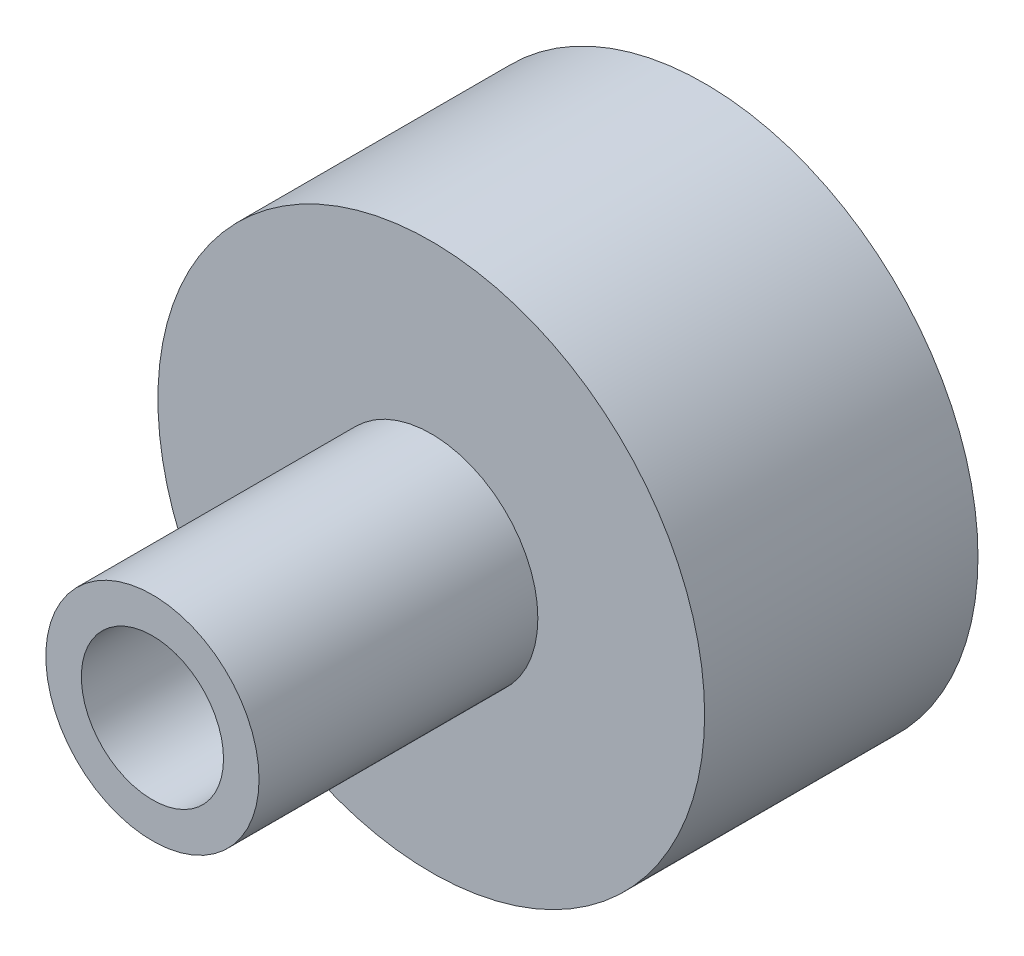
ISO-10303-21;
HEADER;
FILE_DESCRIPTION(('STEP AP214'),'2;1');
FILE_NAME('part.step','',(''),(''),'','','');
FILE_SCHEMA(('AUTOMOTIVE_DESIGN { 1 0 10303 214 1 1 1 1 }'));
ENDSEC;
DATA;
#1=APPLICATION_CONTEXT('core data for automotive mechanical design processes');
#2=APPLICATION_PROTOCOL_DEFINITION('international standard','automotive_design',2000,#1);
#3=PRODUCT_CONTEXT('',#1,'mechanical');
#4=PRODUCT('Part','Part','',(#3));
#5=PRODUCT_RELATED_PRODUCT_CATEGORY('part','',(#4));
#6=PRODUCT_DEFINITION_FORMATION('','',#4);
#7=PRODUCT_DEFINITION_CONTEXT('part definition',#1,'design');
#8=PRODUCT_DEFINITION('design','',#6,#7);
#9=PRODUCT_DEFINITION_SHAPE('','',#8);
#10=(LENGTH_UNIT() NAMED_UNIT(*) SI_UNIT(.MILLI.,.METRE.));
#11=(NAMED_UNIT(*) PLANE_ANGLE_UNIT() SI_UNIT($,.RADIAN.));
#12=(NAMED_UNIT(*) SI_UNIT($,.STERADIAN.) SOLID_ANGLE_UNIT());
#13=UNCERTAINTY_MEASURE_WITH_UNIT(LENGTH_MEASURE(1.E-05),#10,'distance_accuracy_value','');
#14=(GEOMETRIC_REPRESENTATION_CONTEXT(3) GLOBAL_UNCERTAINTY_ASSIGNED_CONTEXT((#13)) GLOBAL_UNIT_ASSIGNED_CONTEXT((#10,
#11,#12)) REPRESENTATION_CONTEXT('',''));
#15=CARTESIAN_POINT('',(0.,0.,0.));
#16=DIRECTION('',(0.,0.,1.));
#17=DIRECTION('',(1.,0.,0.));
#18=AXIS2_PLACEMENT_3D('',#15,#16,#17);
#19=CARTESIAN_POINT('',(0.,0.,10.));
#20=DIRECTION('',(0.,0.,-1.));
#21=DIRECTION('',(-1.,0.,0.));
#22=AXIS2_PLACEMENT_3D('',#19,#20,#21);
#23=CYLINDRICAL_SURFACE('',#22,10.);
#24=CARTESIAN_POINT('',(0.,0.,10.));
#25=DIRECTION('',(0.,0.,1.));
#26=DIRECTION('',(1.,0.,0.));
#27=AXIS2_PLACEMENT_3D('',#24,#25,#26);
#28=CIRCLE('',#27,10.);
#29=CARTESIAN_POINT('',(10.,0.,10.));
#30=VERTEX_POINT('',#29);
#31=EDGE_CURVE('E45',#30,#30,#28,.T.);
#32=ORIENTED_EDGE('',*,*,#31,.F.);
#33=EDGE_LOOP('',(#32));
#34=FACE_BOUND('',#33,.T.);
#35=CARTESIAN_POINT('',(0.,0.,0.));
#36=DIRECTION('',(0.,0.,1.));
#37=DIRECTION('',(1.,0.,0.));
#38=AXIS2_PLACEMENT_3D('',#35,#36,#37);
#39=CIRCLE('',#38,10.);
#40=CARTESIAN_POINT('',(10.,0.,0.));
#41=VERTEX_POINT('',#40);
#42=EDGE_CURVE('E40',#41,#41,#39,.T.);
#43=ORIENTED_EDGE('',*,*,#42,.T.);
#44=EDGE_LOOP('',(#43));
#45=FACE_BOUND('',#44,.T.);
#46=ADVANCED_FACE('F37',(#34,#45),#23,.T.);
#47=CARTESIAN_POINT('',(0.,0.,10.));
#48=DIRECTION('',(0.,0.,1.));
#49=DIRECTION('',(1.,0.,0.));
#50=AXIS2_PLACEMENT_3D('',#47,#48,#49);
#51=PLANE('',#50);
#52=CARTESIAN_POINT('',(0.,0.,10.));
#53=DIRECTION('',(0.,0.,1.));
#54=DIRECTION('',(1.,0.,0.));
#55=AXIS2_PLACEMENT_3D('',#52,#53,#54);
#56=CIRCLE('',#55,3.9);
#57=CARTESIAN_POINT('',(3.9,0.,10.));
#58=VERTEX_POINT('',#57);
#59=EDGE_CURVE('E10',#58,#58,#56,.T.);
#60=ORIENTED_EDGE('',*,*,#59,.F.);
#61=EDGE_LOOP('',(#60));
#62=FACE_BOUND('',#61,.T.);
#63=ORIENTED_EDGE('',*,*,#31,.T.);
#64=EDGE_LOOP('',(#63));
#65=FACE_BOUND('',#64,.T.);
#66=ADVANCED_FACE('F81',(#62,#65),#51,.T.);
#67=CARTESIAN_POINT('',(0.,0.,0.));
#68=DIRECTION('',(0.,0.,1.));
#69=DIRECTION('',(1.,0.,0.));
#70=AXIS2_PLACEMENT_3D('',#67,#68,#69);
#71=PLANE('',#70);
#72=CARTESIAN_POINT('',(0.,0.,0.));
#73=DIRECTION('',(0.,0.,1.));
#74=DIRECTION('',(1.,0.,0.));
#75=AXIS2_PLACEMENT_3D('',#72,#73,#74);
#76=CIRCLE('',#75,2.6);
#77=CARTESIAN_POINT('',(2.6,0.,0.));
#78=VERTEX_POINT('',#77);
#79=EDGE_CURVE('E56',#78,#78,#76,.F.);
#80=ORIENTED_EDGE('',*,*,#79,.F.);
#81=EDGE_LOOP('',(#80));
#82=FACE_BOUND('',#81,.T.);
#83=ORIENTED_EDGE('',*,*,#42,.F.);
#84=EDGE_LOOP('',(#83));
#85=FACE_BOUND('',#84,.T.);
#86=ADVANCED_FACE('F76',(#82,#85),#71,.F.);
#87=CARTESIAN_POINT('',(0.,0.,20.2));
#88=DIRECTION('',(0.,0.,-1.));
#89=DIRECTION('',(-1.,0.,0.));
#90=AXIS2_PLACEMENT_3D('',#87,#88,#89);
#91=CYLINDRICAL_SURFACE('',#90,3.9);
#92=CARTESIAN_POINT('',(0.,0.,20.2));
#93=DIRECTION('',(0.,0.,1.));
#94=DIRECTION('',(1.,0.,0.));
#95=AXIS2_PLACEMENT_3D('',#92,#93,#94);
#96=CIRCLE('',#95,3.9);
#97=CARTESIAN_POINT('',(3.9,0.,20.2));
#98=VERTEX_POINT('',#97);
#99=EDGE_CURVE('E52',#98,#98,#96,.T.);
#100=ORIENTED_EDGE('',*,*,#99,.F.);
#101=EDGE_LOOP('',(#100));
#102=FACE_BOUND('',#101,.T.);
#103=ORIENTED_EDGE('',*,*,#59,.T.);
#104=EDGE_LOOP('',(#103));
#105=FACE_BOUND('',#104,.T.);
#106=ADVANCED_FACE('F71',(#102,#105),#91,.T.);
#107=CARTESIAN_POINT('',(0.,0.,20.2));
#108=DIRECTION('',(0.,0.,1.));
#109=DIRECTION('',(1.,0.,0.));
#110=AXIS2_PLACEMENT_3D('',#107,#108,#109);
#111=PLANE('',#110);
#112=CARTESIAN_POINT('',(0.,0.,20.2));
#113=DIRECTION('',(0.,0.,1.));
#114=DIRECTION('',(1.,0.,0.));
#115=AXIS2_PLACEMENT_3D('',#112,#113,#114);
#116=CIRCLE('',#115,2.6);
#117=CARTESIAN_POINT('',(2.6,0.,20.2));
#118=VERTEX_POINT('',#117);
#119=EDGE_CURVE('E60',#118,#118,#116,.T.);
#120=ORIENTED_EDGE('',*,*,#119,.F.);
#121=EDGE_LOOP('',(#120));
#122=FACE_BOUND('',#121,.T.);
#123=ORIENTED_EDGE('',*,*,#99,.T.);
#124=EDGE_LOOP('',(#123));
#125=FACE_BOUND('',#124,.T.);
#126=ADVANCED_FACE('F68',(#122,#125),#111,.T.);
#127=CARTESIAN_POINT('',(0.,0.,-0.001000000000001));
#128=DIRECTION('',(0.,0.,1.));
#129=DIRECTION('',(1.,0.,0.));
#130=AXIS2_PLACEMENT_3D('',#127,#128,#129);
#131=CYLINDRICAL_SURFACE('',#130,2.6);
#132=CARTESIAN_POINT('',(2.6,0.,20.2));
#133=CARTESIAN_POINT('',(2.6,0.,19.9895833333333));
#134=CARTESIAN_POINT('',(2.6,0.,19.7791666666667));
#135=CARTESIAN_POINT('',(2.6,0.,19.3583333333333));
#136=CARTESIAN_POINT('',(2.6,0.,19.1479166666667));
#137=CARTESIAN_POINT('',(2.6,0.,18.7270833333333));
#138=CARTESIAN_POINT('',(2.6,0.,18.5166666666667));
#139=CARTESIAN_POINT('',(2.6,0.,18.0958333333333));
#140=CARTESIAN_POINT('',(2.6,0.,17.8854166666667));
#141=CARTESIAN_POINT('',(2.6,0.,17.4645833333333));
#142=CARTESIAN_POINT('',(2.6,0.,17.2541666666667));
#143=CARTESIAN_POINT('',(2.6,0.,16.8333333333333));
#144=CARTESIAN_POINT('',(2.6,0.,16.6229166666667));
#145=CARTESIAN_POINT('',(2.6,0.,16.2020833333333));
#146=CARTESIAN_POINT('',(2.6,0.,15.9916666666667));
#147=CARTESIAN_POINT('',(2.6,0.,15.5708333333333));
#148=CARTESIAN_POINT('',(2.6,0.,15.3604166666667));
#149=CARTESIAN_POINT('',(2.6,0.,14.9395833333333));
#150=CARTESIAN_POINT('',(2.6,0.,14.7291666666667));
#151=CARTESIAN_POINT('',(2.6,0.,14.3083333333333));
#152=CARTESIAN_POINT('',(2.6,0.,14.0979166666667));
#153=CARTESIAN_POINT('',(2.6,0.,13.6770833333333));
#154=CARTESIAN_POINT('',(2.6,0.,13.4666666666667));
#155=CARTESIAN_POINT('',(2.6,0.,13.0458333333333));
#156=CARTESIAN_POINT('',(2.6,0.,12.8354166666667));
#157=CARTESIAN_POINT('',(2.6,0.,12.4145833333333));
#158=CARTESIAN_POINT('',(2.6,0.,12.2041666666667));
#159=CARTESIAN_POINT('',(2.6,0.,11.7833333333333));
#160=CARTESIAN_POINT('',(2.6,0.,11.5729166666667));
#161=CARTESIAN_POINT('',(2.6,0.,11.1520833333333));
#162=CARTESIAN_POINT('',(2.6,0.,10.9416666666667));
#163=CARTESIAN_POINT('',(2.6,0.,10.5208333333333));
#164=CARTESIAN_POINT('',(2.6,0.,10.3104166666667));
#165=CARTESIAN_POINT('',(2.6,0.,9.88958333333333));
#166=CARTESIAN_POINT('',(2.6,0.,9.67916666666667));
#167=CARTESIAN_POINT('',(2.6,0.,9.25833333333333));
#168=CARTESIAN_POINT('',(2.6,0.,9.04791666666667));
#169=CARTESIAN_POINT('',(2.6,0.,8.62708333333333));
#170=CARTESIAN_POINT('',(2.6,0.,8.41666666666667));
#171=CARTESIAN_POINT('',(2.6,0.,7.99583333333333));
#172=CARTESIAN_POINT('',(2.6,0.,7.78541666666667));
#173=CARTESIAN_POINT('',(2.6,0.,7.36458333333333));
#174=CARTESIAN_POINT('',(2.6,0.,7.15416666666667));
#175=CARTESIAN_POINT('',(2.6,0.,6.73333333333333));
#176=CARTESIAN_POINT('',(2.6,0.,6.52291666666667));
#177=CARTESIAN_POINT('',(2.6,0.,6.10208333333333));
#178=CARTESIAN_POINT('',(2.6,0.,5.89166666666667));
#179=CARTESIAN_POINT('',(2.6,0.,5.47083333333333));
#180=CARTESIAN_POINT('',(2.6,0.,5.26041666666667));
#181=CARTESIAN_POINT('',(2.6,0.,4.83958333333333));
#182=CARTESIAN_POINT('',(2.6,0.,4.62916666666667));
#183=CARTESIAN_POINT('',(2.6,0.,4.20833333333333));
#184=CARTESIAN_POINT('',(2.6,0.,3.99791666666667));
#185=CARTESIAN_POINT('',(2.6,0.,3.57708333333333));
#186=CARTESIAN_POINT('',(2.6,0.,3.36666666666667));
#187=CARTESIAN_POINT('',(2.6,0.,2.94583333333333));
#188=CARTESIAN_POINT('',(2.6,0.,2.73541666666667));
#189=CARTESIAN_POINT('',(2.6,0.,2.31458333333333));
#190=CARTESIAN_POINT('',(2.6,0.,2.10416666666667));
#191=CARTESIAN_POINT('',(2.6,0.,1.68333333333333));
#192=CARTESIAN_POINT('',(2.6,0.,1.47291666666667));
#193=CARTESIAN_POINT('',(2.6,0.,1.05208333333333));
#194=CARTESIAN_POINT('',(2.6,0.,0.841666666666666));
#195=CARTESIAN_POINT('',(2.6,0.,0.420833333333333));
#196=CARTESIAN_POINT('',(2.6,0.,0.210416666666667));
#197=CARTESIAN_POINT('',(2.6,0.,0.));
#198=B_SPLINE_CURVE_WITH_KNOTS('',3,(#132,#133,#134,#135,#136,#137,#138,#139,#140,#141,#142,
#143,#144,#145,#146,#147,#148,#149,#150,#151,#152,#153,#154,#155,#156,#157,#158,#159,#160,#161,
#162,#163,#164,#165,#166,#167,#168,#169,#170,#171,#172,#173,#174,#175,#176,#177,#178,#179,#180,
#181,#182,#183,#184,#185,#186,#187,#188,#189,#190,#191,#192,#193,#194,#195,#196,#197),
.UNSPECIFIED.,.F.,.F.,(4,2,2,2,2,2,2,2,2,2,2,2,2,2,2,2,2,2,2,2,2,2,2,2,2,2,2,2,2,2,2,2,4),(0.,
0.63125,1.2625,1.89375,2.525,3.15625,3.7875,4.41875,5.05,5.68125,6.3125,6.94375,7.575,8.20625,
8.8375,9.46875,10.1,10.73125,11.3625,11.99375,12.625,13.25625,13.8875,14.51875,15.15,15.78125,
16.4125,17.04375,17.675,18.30625,18.9375,19.56875,20.2),.UNSPECIFIED.);
#199=EDGE_CURVE('BSEAM65',#118,#78,#198,.T.);
#200=ORIENTED_EDGE('',*,*,#119,.T.);
#201=ORIENTED_EDGE('',*,*,#79,.T.);
#202=ORIENTED_EDGE('',*,*,#199,.T.);
#203=ORIENTED_EDGE('',*,*,#199,.F.);
#204=EDGE_LOOP('',(#200,#202,#201,#203));
#205=FACE_BOUND('',#204,.T.);
#206=ADVANCED_FACE('F65',(#205),#131,.F.);
#207=CLOSED_SHELL('',(#46,#66,#86,#106,#126,#206));
#208=MANIFOLD_SOLID_BREP('B2',#207);
#209=ADVANCED_BREP_SHAPE_REPRESENTATION('',(#18,#208),#14);
#210=SHAPE_DEFINITION_REPRESENTATION(#9,#209);
ENDSEC;
END-ISO-10303-21;
